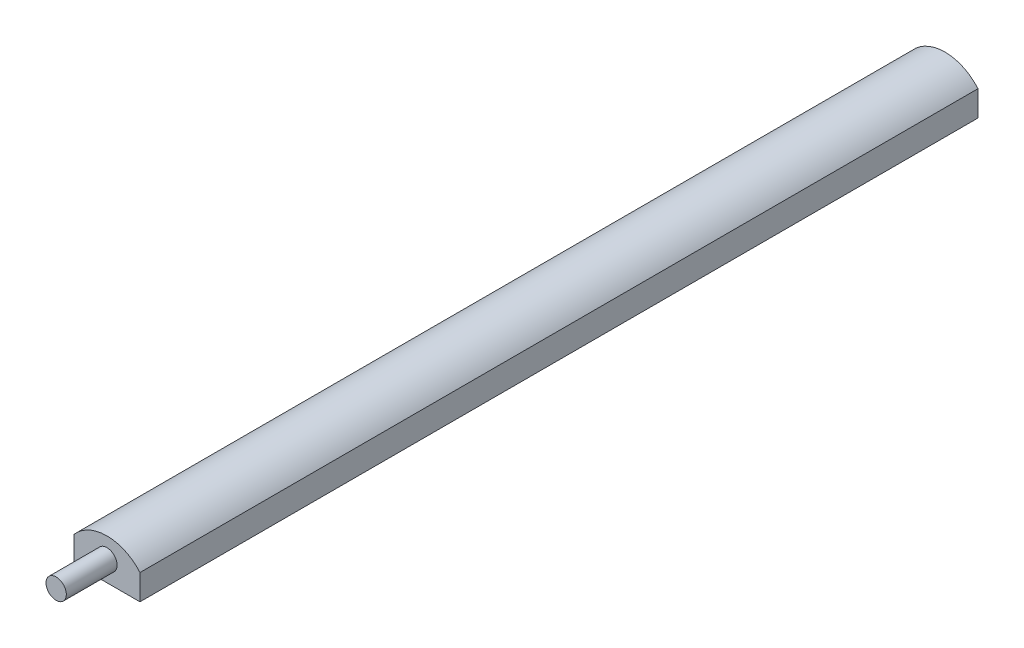
ISO-10303-21;
HEADER;
FILE_DESCRIPTION(('STEP AP214'),'2;1');
FILE_NAME('part.step','',(''),(''),'','','');
FILE_SCHEMA(('AUTOMOTIVE_DESIGN { 1 0 10303 214 1 1 1 1 }'));
ENDSEC;
DATA;
#1=APPLICATION_CONTEXT('core data for automotive mechanical design processes');
#2=APPLICATION_PROTOCOL_DEFINITION('international standard','automotive_design',2000,#1);
#3=PRODUCT_CONTEXT('',#1,'mechanical');
#4=PRODUCT('Part','Part','',(#3));
#5=PRODUCT_RELATED_PRODUCT_CATEGORY('part','',(#4));
#6=PRODUCT_DEFINITION_FORMATION('','',#4);
#7=PRODUCT_DEFINITION_CONTEXT('part definition',#1,'design');
#8=PRODUCT_DEFINITION('design','',#6,#7);
#9=PRODUCT_DEFINITION_SHAPE('','',#8);
#10=(LENGTH_UNIT() NAMED_UNIT(*) SI_UNIT(.MILLI.,.METRE.));
#11=(NAMED_UNIT(*) PLANE_ANGLE_UNIT() SI_UNIT($,.RADIAN.));
#12=(NAMED_UNIT(*) SI_UNIT($,.STERADIAN.) SOLID_ANGLE_UNIT());
#13=UNCERTAINTY_MEASURE_WITH_UNIT(LENGTH_MEASURE(1.E-05),#10,'distance_accuracy_value','');
#14=(GEOMETRIC_REPRESENTATION_CONTEXT(3) GLOBAL_UNCERTAINTY_ASSIGNED_CONTEXT((#13)) GLOBAL_UNIT_ASSIGNED_CONTEXT((#10,
#11,#12)) REPRESENTATION_CONTEXT('',''));
#15=CARTESIAN_POINT('',(0.,0.,0.));
#16=DIRECTION('',(0.,0.,1.));
#17=DIRECTION('',(1.,0.,0.));
#18=AXIS2_PLACEMENT_3D('',#15,#16,#17);
#19=CARTESIAN_POINT('',(0.,0.,165.));
#20=DIRECTION('',(1.,0.,0.));
#21=DIRECTION('',(0.,0.,-1.));
#22=AXIS2_PLACEMENT_3D('',#19,#20,#21);
#23=PLANE('',#22);
#24=DIRECTION('',(0.,-1.,0.));
#25=VECTOR('',#24,1.);
#26=CARTESIAN_POINT('',(0.,0.,0.));
#27=LINE('',#26,#25);
#28=CARTESIAN_POINT('',(0.,5.,0.));
#29=VERTEX_POINT('',#28);
#30=CARTESIAN_POINT('',(0.,0.,0.));
#31=VERTEX_POINT('',#30);
#32=EDGE_CURVE('E105',#29,#31,#27,.T.);
#33=ORIENTED_EDGE('',*,*,#32,.T.);
#34=DIRECTION('',(0.,0.,-1.));
#35=VECTOR('',#34,1.);
#36=CARTESIAN_POINT('',(0.,0.,165.));
#37=LINE('',#36,#35);
#38=CARTESIAN_POINT('',(0.,0.,165.));
#39=VERTEX_POINT('',#38);
#40=EDGE_CURVE('E47',#39,#31,#37,.T.);
#41=ORIENTED_EDGE('',*,*,#40,.F.);
#42=DIRECTION('',(0.,-1.,0.));
#43=VECTOR('',#42,1.);
#44=CARTESIAN_POINT('',(0.,0.,165.));
#45=LINE('',#44,#43);
#46=CARTESIAN_POINT('',(0.,5.,165.));
#47=VERTEX_POINT('',#46);
#48=EDGE_CURVE('E91',#47,#39,#45,.T.);
#49=ORIENTED_EDGE('',*,*,#48,.F.);
#50=DIRECTION('',(0.,0.,-1.));
#51=VECTOR('',#50,1.);
#52=CARTESIAN_POINT('',(0.,5.,165.));
#53=LINE('',#52,#51);
#54=EDGE_CURVE('E101',#47,#29,#53,.T.);
#55=ORIENTED_EDGE('',*,*,#54,.T.);
#56=EDGE_LOOP('',(#33,#41,#49,#55));
#57=FACE_BOUND('',#56,.T.);
#58=ADVANCED_FACE('F39',(#57),#23,.F.);
#59=CARTESIAN_POINT('',(0.,0.,165.));
#60=DIRECTION('',(0.,1.,0.));
#61=DIRECTION('',(0.,0.,1.));
#62=AXIS2_PLACEMENT_3D('',#59,#60,#61);
#63=PLANE('',#62);
#64=DIRECTION('',(1.,0.,0.));
#65=VECTOR('',#64,1.);
#66=CARTESIAN_POINT('',(0.,0.,0.));
#67=LINE('',#66,#65);
#68=CARTESIAN_POINT('',(13.,0.,0.));
#69=VERTEX_POINT('',#68);
#70=EDGE_CURVE('E96',#31,#69,#67,.T.);
#71=ORIENTED_EDGE('',*,*,#70,.T.);
#72=DIRECTION('',(0.,0.,-1.));
#73=VECTOR('',#72,1.);
#74=CARTESIAN_POINT('',(13.,0.,165.));
#75=LINE('',#74,#73);
#76=CARTESIAN_POINT('',(13.,0.,165.));
#77=VERTEX_POINT('',#76);
#78=EDGE_CURVE('E94',#77,#69,#75,.T.);
#79=ORIENTED_EDGE('',*,*,#78,.F.);
#80=DIRECTION('',(1.,0.,0.));
#81=VECTOR('',#80,1.);
#82=CARTESIAN_POINT('',(0.,0.,165.));
#83=LINE('',#82,#81);
#84=EDGE_CURVE('E86',#39,#77,#83,.T.);
#85=ORIENTED_EDGE('',*,*,#84,.F.);
#86=ORIENTED_EDGE('',*,*,#40,.T.);
#87=EDGE_LOOP('',(#71,#79,#85,#86));
#88=FACE_BOUND('',#87,.T.);
#89=ADVANCED_FACE('F95',(#88),#63,.F.);
#90=CARTESIAN_POINT('',(13.,0.,165.));
#91=DIRECTION('',(-1.,0.,0.));
#92=DIRECTION('',(0.,0.,1.));
#93=AXIS2_PLACEMENT_3D('',#90,#91,#92);
#94=PLANE('',#93);
#95=DIRECTION('',(0.,1.,0.));
#96=VECTOR('',#95,1.);
#97=CARTESIAN_POINT('',(13.,0.,0.));
#98=LINE('',#97,#96);
#99=CARTESIAN_POINT('',(13.,5.,0.));
#100=VERTEX_POINT('',#99);
#101=EDGE_CURVE('E72',#69,#100,#98,.T.);
#102=ORIENTED_EDGE('',*,*,#101,.T.);
#103=DIRECTION('',(0.,0.,-1.));
#104=VECTOR('',#103,1.);
#105=CARTESIAN_POINT('',(13.,5.,165.));
#106=LINE('',#105,#104);
#107=CARTESIAN_POINT('',(13.,5.,165.));
#108=VERTEX_POINT('',#107);
#109=EDGE_CURVE('E97',#108,#100,#106,.T.);
#110=ORIENTED_EDGE('',*,*,#109,.F.);
#111=DIRECTION('',(0.,1.,0.));
#112=VECTOR('',#111,1.);
#113=CARTESIAN_POINT('',(13.,0.,165.));
#114=LINE('',#113,#112);
#115=EDGE_CURVE('E89',#77,#108,#114,.T.);
#116=ORIENTED_EDGE('',*,*,#115,.F.);
#117=ORIENTED_EDGE('',*,*,#78,.T.);
#118=EDGE_LOOP('',(#102,#110,#116,#117));
#119=FACE_BOUND('',#118,.T.);
#120=ADVANCED_FACE('F99',(#119),#94,.F.);
#121=CARTESIAN_POINT('',(6.5,-0.541666666666665,165.));
#122=DIRECTION('',(0.,0.,-1.));
#123=DIRECTION('',(-1.,0.,0.));
#124=AXIS2_PLACEMENT_3D('',#121,#122,#123);
#125=CYLINDRICAL_SURFACE('',#124,8.54166666666667);
#126=CARTESIAN_POINT('',(6.5,-0.541666666666665,0.));
#127=DIRECTION('',(0.,0.,1.));
#128=DIRECTION('',(-1.,0.,0.));
#129=AXIS2_PLACEMENT_3D('',#126,#127,#128);
#130=CIRCLE('',#129,8.54166666666667);
#131=EDGE_CURVE('E78',#100,#29,#130,.T.);
#132=ORIENTED_EDGE('',*,*,#131,.T.);
#133=ORIENTED_EDGE('',*,*,#54,.F.);
#134=CARTESIAN_POINT('',(6.5,-0.541666666666665,165.));
#135=DIRECTION('',(0.,0.,1.));
#136=DIRECTION('',(-1.,0.,0.));
#137=AXIS2_PLACEMENT_3D('',#134,#135,#136);
#138=CIRCLE('',#137,8.54166666666667);
#139=EDGE_CURVE('E55',#108,#47,#138,.T.);
#140=ORIENTED_EDGE('',*,*,#139,.F.);
#141=ORIENTED_EDGE('',*,*,#109,.T.);
#142=EDGE_LOOP('',(#132,#133,#140,#141));
#143=FACE_BOUND('',#142,.T.);
#144=ADVANCED_FACE('F127',(#143),#125,.T.);
#145=CARTESIAN_POINT('',(6.5,-0.541666666666665,165.));
#146=DIRECTION('',(0.,0.,-1.));
#147=DIRECTION('',(-1.,0.,0.));
#148=AXIS2_PLACEMENT_3D('',#145,#146,#147);
#149=PLANE('',#148);
#150=CARTESIAN_POINT('',(6.5,4.,165.));
#151=DIRECTION('',(0.,0.,-1.));
#152=DIRECTION('',(-1.,0.,0.));
#153=AXIS2_PLACEMENT_3D('',#150,#151,#152);
#154=CIRCLE('',#153,2.);
#155=CARTESIAN_POINT('',(4.5,4.,165.));
#156=VERTEX_POINT('',#155);
#157=EDGE_CURVE('E11',#156,#156,#154,.F.);
#158=ORIENTED_EDGE('',*,*,#157,.F.);
#159=EDGE_LOOP('',(#158));
#160=FACE_BOUND('',#159,.T.);
#161=ORIENTED_EDGE('',*,*,#48,.T.);
#162=ORIENTED_EDGE('',*,*,#84,.T.);
#163=ORIENTED_EDGE('',*,*,#115,.T.);
#164=ORIENTED_EDGE('',*,*,#139,.T.);
#165=EDGE_LOOP('',(#161,#162,#163,#164));
#166=FACE_BOUND('',#165,.T.);
#167=ADVANCED_FACE('F87',(#160,#166),#149,.F.);
#168=CARTESIAN_POINT('',(6.5,-0.541666666666665,0.));
#169=DIRECTION('',(0.,0.,-1.));
#170=DIRECTION('',(-1.,0.,0.));
#171=AXIS2_PLACEMENT_3D('',#168,#169,#170);
#172=PLANE('',#171);
#173=ORIENTED_EDGE('',*,*,#32,.F.);
#174=ORIENTED_EDGE('',*,*,#131,.F.);
#175=ORIENTED_EDGE('',*,*,#101,.F.);
#176=ORIENTED_EDGE('',*,*,#70,.F.);
#177=EDGE_LOOP('',(#173,#174,#175,#176));
#178=FACE_BOUND('',#177,.T.);
#179=ADVANCED_FACE('F116',(#178),#172,.T.);
#180=CARTESIAN_POINT('',(6.5,4.,175.));
#181=DIRECTION('',(0.,0.,-1.));
#182=DIRECTION('',(-1.,0.,0.));
#183=AXIS2_PLACEMENT_3D('',#180,#181,#182);
#184=CYLINDRICAL_SURFACE('',#183,2.);
#185=CARTESIAN_POINT('',(6.5,4.,175.));
#186=DIRECTION('',(0.,0.,1.));
#187=DIRECTION('',(1.,0.,0.));
#188=AXIS2_PLACEMENT_3D('',#185,#186,#187);
#189=CIRCLE('',#188,2.);
#190=CARTESIAN_POINT('',(8.5,4.,175.));
#191=VERTEX_POINT('',#190);
#192=EDGE_CURVE('E108',#191,#191,#189,.T.);
#193=ORIENTED_EDGE('',*,*,#192,.F.);
#194=EDGE_LOOP('',(#193));
#195=FACE_BOUND('',#194,.T.);
#196=ORIENTED_EDGE('',*,*,#157,.T.);
#197=EDGE_LOOP('',(#196));
#198=FACE_BOUND('',#197,.T.);
#199=ADVANCED_FACE('F118',(#195,#198),#184,.T.);
#200=CARTESIAN_POINT('',(6.5,4.,175.));
#201=DIRECTION('',(0.,0.,1.));
#202=DIRECTION('',(1.,0.,0.));
#203=AXIS2_PLACEMENT_3D('',#200,#201,#202);
#204=PLANE('',#203);
#205=ORIENTED_EDGE('',*,*,#192,.T.);
#206=EDGE_LOOP('',(#205));
#207=FACE_BOUND('',#206,.T.);
#208=ADVANCED_FACE('F124',(#207),#204,.T.);
#209=CLOSED_SHELL('',(#58,#89,#120,#144,#167,#179,#199,#208));
#210=MANIFOLD_SOLID_BREP('B2',#209);
#211=ADVANCED_BREP_SHAPE_REPRESENTATION('',(#18,#210),#14);
#212=SHAPE_DEFINITION_REPRESENTATION(#9,#211);
ENDSEC;
END-ISO-10303-21;
